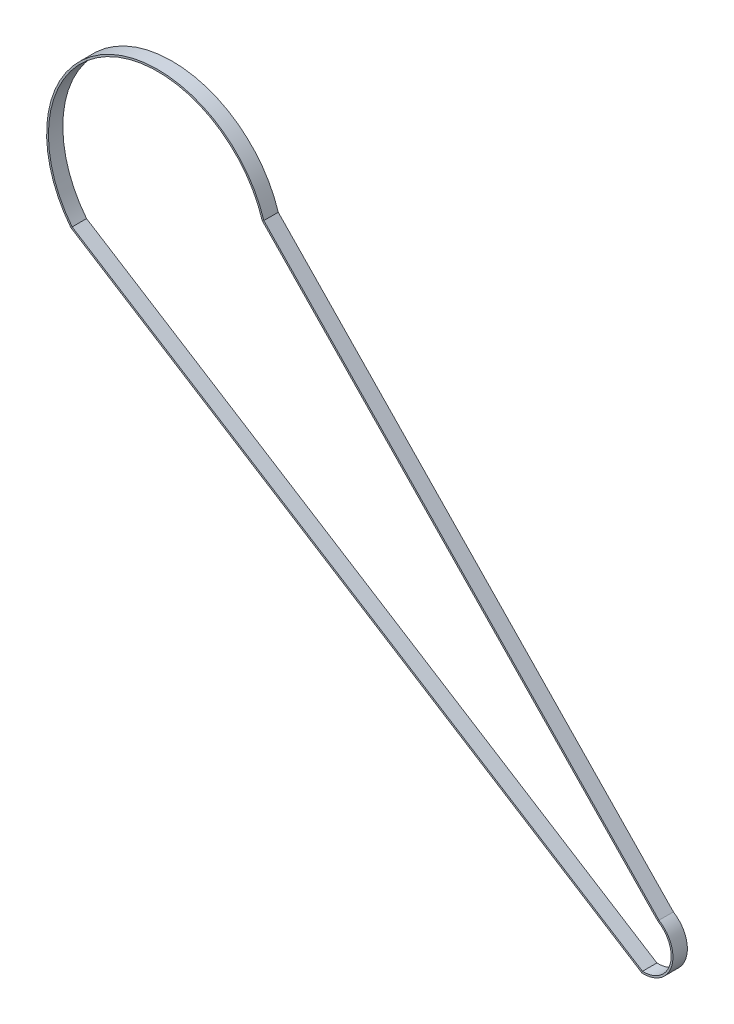
ISO-10303-21;
HEADER;
FILE_DESCRIPTION(('STEP AP214'),'2;1');
FILE_NAME('part.step','',(''),(''),'','','');
FILE_SCHEMA(('AUTOMOTIVE_DESIGN { 1 0 10303 214 1 1 1 1 }'));
ENDSEC;
DATA;
#1=APPLICATION_CONTEXT('core data for automotive mechanical design processes');
#2=APPLICATION_PROTOCOL_DEFINITION('international standard','automotive_design',2000,#1);
#3=PRODUCT_CONTEXT('',#1,'mechanical');
#4=PRODUCT('Part','Part','',(#3));
#5=PRODUCT_RELATED_PRODUCT_CATEGORY('part','',(#4));
#6=PRODUCT_DEFINITION_FORMATION('','',#4);
#7=PRODUCT_DEFINITION_CONTEXT('part definition',#1,'design');
#8=PRODUCT_DEFINITION('design','',#6,#7);
#9=PRODUCT_DEFINITION_SHAPE('','',#8);
#10=(LENGTH_UNIT() NAMED_UNIT(*) SI_UNIT(.MILLI.,.METRE.));
#11=(NAMED_UNIT(*) PLANE_ANGLE_UNIT() SI_UNIT($,.RADIAN.));
#12=(NAMED_UNIT(*) SI_UNIT($,.STERADIAN.) SOLID_ANGLE_UNIT());
#13=UNCERTAINTY_MEASURE_WITH_UNIT(LENGTH_MEASURE(1.E-05),#10,'distance_accuracy_value','');
#14=(GEOMETRIC_REPRESENTATION_CONTEXT(3) GLOBAL_UNCERTAINTY_ASSIGNED_CONTEXT((#13)) GLOBAL_UNIT_ASSIGNED_CONTEXT((#10,
#11,#12)) REPRESENTATION_CONTEXT('',''));
#15=CARTESIAN_POINT('',(0.,0.,0.));
#16=DIRECTION('',(0.,0.,1.));
#17=DIRECTION('',(1.,0.,0.));
#18=AXIS2_PLACEMENT_3D('',#15,#16,#17);
#19=CARTESIAN_POINT('',(136.426637508581,-40.646582291838,0.));
#20=DIRECTION('',(0.,0.,-1.));
#21=DIRECTION('',(-1.,0.,0.));
#22=AXIS2_PLACEMENT_3D('',#19,#20,#21);
#23=CYLINDRICAL_SURFACE('',#22,8.1833821549531);
#24=CARTESIAN_POINT('',(136.426637508581,-40.646582291838,2.01184288699567));
#25=DIRECTION('',(0.,0.,-1.));
#26=DIRECTION('',(-1.,0.,0.));
#27=AXIS2_PLACEMENT_3D('',#24,#25,#26);
#28=CIRCLE('',#27,8.1833821549531);
#29=CARTESIAN_POINT('',(140.716996476225,-33.6780413094834,2.01184288699567));
#30=VERTEX_POINT('',#29);
#31=CARTESIAN_POINT('',(135.949528288203,-48.8160443479244,2.01184288699567));
#32=VERTEX_POINT('',#31);
#33=EDGE_CURVE('E64',#30,#32,#28,.T.);
#34=ORIENTED_EDGE('',*,*,#33,.T.);
#35=CARTESIAN_POINT('',(135.949528288203,-48.8160443479244,2.01184288699567));
#36=DIRECTION('',(0.,0.,-1.));
#37=VECTOR('',#36,1.);
#38=LINE('',#35,#37);
#39=CARTESIAN_POINT('',(135.949528288203,-48.8160443479244,-2.01184288699567));
#40=VERTEX_POINT('',#39);
#41=EDGE_CURVE('E113',#32,#40,#38,.T.);
#42=ORIENTED_EDGE('',*,*,#41,.T.);
#43=CARTESIAN_POINT('',(136.426637508581,-40.646582291838,-2.01184288699567));
#44=DIRECTION('',(0.,0.,-1.));
#45=DIRECTION('',(-1.,0.,0.));
#46=AXIS2_PLACEMENT_3D('',#43,#44,#45);
#47=CIRCLE('',#46,8.18338215495311);
#48=CARTESIAN_POINT('',(140.716996476225,-33.6780413094834,-2.01184288699567));
#49=VERTEX_POINT('',#48);
#50=EDGE_CURVE('E131',#49,#40,#47,.T.);
#51=ORIENTED_EDGE('',*,*,#50,.F.);
#52=DIRECTION('',(0.,0.,1.));
#53=VECTOR('',#52,1.);
#54=CARTESIAN_POINT('',(140.716996476225,-33.6780413094834,0.));
#55=LINE('',#54,#53);
#56=EDGE_CURVE('E207',#49,#30,#55,.T.);
#57=ORIENTED_EDGE('',*,*,#56,.T.);
#58=EDGE_LOOP('',(#34,#42,#51,#57));
#59=FACE_BOUND('',#58,.T.);
#60=ADVANCED_FACE('F36',(#59),#23,.T.);
#61=CARTESIAN_POINT('',(116.866624366443,-63.4781373697456,-2.01184288699567));
#62=DIRECTION('',(0.,0.,-1.));
#63=DIRECTION('',(-1.,0.,0.));
#64=AXIS2_PLACEMENT_3D('',#61,#62,#63);
#65=PLANE('',#64);
#66=ORIENTED_EDGE('',*,*,#50,.T.);
#67=CARTESIAN_POINT('',(135.949528288203,-48.8160443479244,-2.01184288699567));
#68=DIRECTION('',(0.301700403503318,0.953402782944299,0.));
#69=VECTOR('',#68,1.);
#70=LINE('',#67,#69);
#71=CARTESIAN_POINT('',(136.105468965935,-48.3232565544801,-2.01184288699567));
#72=VERTEX_POINT('',#71);
#73=EDGE_CURVE('E48',#40,#72,#70,.T.);
#74=ORIENTED_EDGE('',*,*,#73,.T.);
#75=CARTESIAN_POINT('',(136.426637508581,-40.646582291838,-2.01184288699567));
#76=DIRECTION('',(0.,0.,-1.));
#77=DIRECTION('',(-1.,0.,0.));
#78=AXIS2_PLACEMENT_3D('',#75,#76,#77);
#79=CIRCLE('',#78,7.68338967952924);
#80=CARTESIAN_POINT('',(140.402032839187,-34.0715759091121,-2.01184288699567));
#81=VERTEX_POINT('',#80);
#82=EDGE_CURVE('E136',#81,#72,#79,.T.);
#83=ORIENTED_EDGE('',*,*,#82,.F.);
#84=DIRECTION('',(0.624859501450093,0.780737217921332,0.));
#85=VECTOR('',#84,1.);
#86=CARTESIAN_POINT('',(116.866624366443,-63.4781373697456,-2.01184288699567));
#87=LINE('',#86,#85);
#88=EDGE_CURVE('E134',#81,#49,#87,.T.);
#89=ORIENTED_EDGE('',*,*,#88,.T.);
#90=EDGE_LOOP('',(#66,#74,#83,#89));
#91=FACE_BOUND('',#90,.T.);
#92=ADVANCED_FACE('F132',(#91),#65,.T.);
#93=CARTESIAN_POINT('',(136.426637508581,-40.646582291838,0.));
#94=DIRECTION('',(0.,0.,-1.));
#95=DIRECTION('',(-1.,0.,0.));
#96=AXIS2_PLACEMENT_3D('',#93,#94,#95);
#97=CYLINDRICAL_SURFACE('',#96,7.68338967952924);
#98=ORIENTED_EDGE('',*,*,#82,.T.);
#99=CARTESIAN_POINT('',(136.105468965935,-48.3232565544801,-2.01184288699567));
#100=DIRECTION('',(0.,0.,1.));
#101=VECTOR('',#100,1.);
#102=LINE('',#99,#101);
#103=CARTESIAN_POINT('',(136.105468965935,-48.3232565544801,2.01184288699567));
#104=VERTEX_POINT('',#103);
#105=EDGE_CURVE('E12',#72,#104,#102,.T.);
#106=ORIENTED_EDGE('',*,*,#105,.T.);
#107=CARTESIAN_POINT('',(136.426637508581,-40.646582291838,2.01184288699567));
#108=DIRECTION('',(0.,0.,-1.));
#109=DIRECTION('',(-1.,0.,0.));
#110=AXIS2_PLACEMENT_3D('',#107,#108,#109);
#111=CIRCLE('',#110,7.68338967952924);
#112=CARTESIAN_POINT('',(140.402032839187,-34.0715759091121,2.01184288699567));
#113=VERTEX_POINT('',#112);
#114=EDGE_CURVE('E177',#113,#104,#111,.T.);
#115=ORIENTED_EDGE('',*,*,#114,.F.);
#116=DIRECTION('',(0.,0.,-1.));
#117=VECTOR('',#116,1.);
#118=CARTESIAN_POINT('',(140.402032839187,-34.0715759091121,0.));
#119=LINE('',#118,#117);
#120=EDGE_CURVE('E211',#113,#81,#119,.T.);
#121=ORIENTED_EDGE('',*,*,#120,.T.);
#122=EDGE_LOOP('',(#98,#106,#115,#121));
#123=FACE_BOUND('',#122,.T.);
#124=ADVANCED_FACE('F162',(#123),#97,.F.);
#125=CARTESIAN_POINT('',(116.866624366443,-63.4781373697456,2.01184288699567));
#126=DIRECTION('',(0.,0.,1.));
#127=DIRECTION('',(1.,0.,0.));
#128=AXIS2_PLACEMENT_3D('',#125,#126,#127);
#129=PLANE('',#128);
#130=ORIENTED_EDGE('',*,*,#114,.T.);
#131=CARTESIAN_POINT('',(136.105468965935,-48.3232565544801,2.01184288699567));
#132=DIRECTION('',(-0.301700403503289,-0.953402782944309,0.));
#133=VECTOR('',#132,1.);
#134=LINE('',#131,#133);
#135=EDGE_CURVE('E55',#104,#32,#134,.T.);
#136=ORIENTED_EDGE('',*,*,#135,.T.);
#137=ORIENTED_EDGE('',*,*,#33,.F.);
#138=DIRECTION('',(-0.624859501450093,-0.780737217921332,0.));
#139=VECTOR('',#138,1.);
#140=CARTESIAN_POINT('',(116.866624366443,-63.4781373697456,2.01184288699567));
#141=LINE('',#140,#139);
#142=EDGE_CURVE('E137',#30,#113,#141,.T.);
#143=ORIENTED_EDGE('',*,*,#142,.T.);
#144=EDGE_LOOP('',(#130,#136,#137,#143));
#145=FACE_BOUND('',#144,.T.);
#146=ADVANCED_FACE('F38',(#145),#129,.T.);
#147=CARTESIAN_POINT('',(30.3756081974133,80.349878016199,0.));
#148=DIRECTION('',(-0.718628001309774,-0.695394704993876,0.));
#149=DIRECTION('',(0.695394704993876,-0.718628001309774,0.));
#150=AXIS2_PLACEMENT_3D('',#147,#148,#149);
#151=PLANE('',#150);
#152=ORIENTED_EDGE('',*,*,#56,.F.);
#153=DIRECTION('',(0.695394704993876,-0.718628001309774,0.));
#154=VECTOR('',#153,1.);
#155=CARTESIAN_POINT('',(30.3756081974133,80.349878016199,-2.01184288699567));
#156=LINE('',#155,#154);
#157=CARTESIAN_POINT('',(30.3756081974133,80.349878016199,-2.01184288699567));
#158=VERTEX_POINT('',#157);
#159=EDGE_CURVE('E218',#158,#49,#156,.T.);
#160=ORIENTED_EDGE('',*,*,#159,.F.);
#161=DIRECTION('',(0.,0.,-1.));
#162=VECTOR('',#161,1.);
#163=CARTESIAN_POINT('',(30.3756081974133,80.349878016199,0.));
#164=LINE('',#163,#162);
#165=CARTESIAN_POINT('',(30.3756081974133,80.349878016199,2.01184288699567));
#166=VERTEX_POINT('',#165);
#167=EDGE_CURVE('E222',#166,#158,#164,.T.);
#168=ORIENTED_EDGE('',*,*,#167,.F.);
#169=DIRECTION('',(0.695394704993876,-0.718628001309774,0.));
#170=VECTOR('',#169,1.);
#171=CARTESIAN_POINT('',(30.3756081974133,80.349878016199,2.01184288699567));
#172=LINE('',#171,#170);
#173=EDGE_CURVE('E208',#166,#30,#172,.T.);
#174=ORIENTED_EDGE('',*,*,#173,.T.);
#175=EDGE_LOOP('',(#152,#160,#168,#174));
#176=FACE_BOUND('',#175,.T.);
#177=ADVANCED_FACE('F276',(#176),#151,.F.);
#178=CARTESIAN_POINT('',(-23.1455576442709,48.5799792922034,-2.01184288699567));
#179=DIRECTION('',(0.,0.,1.));
#180=DIRECTION('',(1.,0.,0.));
#181=AXIS2_PLACEMENT_3D('',#178,#179,#180);
#182=PLANE('',#181);
#183=ORIENTED_EDGE('',*,*,#88,.F.);
#184=DIRECTION('',(0.695394704993876,-0.718628001309774,0.));
#185=VECTOR('',#184,1.);
#186=CARTESIAN_POINT('',(29.9336789323946,80.0875509952529,-2.01184288699567));
#187=LINE('',#186,#185);
#188=CARTESIAN_POINT('',(29.9336789323946,80.0875509952529,-2.01184288699567));
#189=VERTEX_POINT('',#188);
#190=EDGE_CURVE('E215',#189,#81,#187,.T.);
#191=ORIENTED_EDGE('',*,*,#190,.F.);
#192=DIRECTION('',(-0.859913233424366,-0.510440232526446,0.));
#193=VECTOR('',#192,1.);
#194=CARTESIAN_POINT('',(-23.1455576442709,48.5799792922034,-2.01184288699567));
#195=LINE('',#194,#193);
#196=EDGE_CURVE('E225',#158,#189,#195,.T.);
#197=ORIENTED_EDGE('',*,*,#196,.F.);
#198=ORIENTED_EDGE('',*,*,#159,.T.);
#199=EDGE_LOOP('',(#183,#191,#197,#198));
#200=FACE_BOUND('',#199,.T.);
#201=ADVANCED_FACE('F262',(#200),#182,.F.);
#202=CARTESIAN_POINT('',(29.9336789323946,80.0875509952529,0.));
#203=DIRECTION('',(0.718628001309774,0.695394704993876,0.));
#204=DIRECTION('',(-0.695394704993876,0.718628001309774,0.));
#205=AXIS2_PLACEMENT_3D('',#202,#203,#204);
#206=PLANE('',#205);
#207=ORIENTED_EDGE('',*,*,#120,.F.);
#208=DIRECTION('',(0.695394704993876,-0.718628001309774,0.));
#209=VECTOR('',#208,1.);
#210=CARTESIAN_POINT('',(29.9336789323946,80.0875509952529,2.01184288699567));
#211=LINE('',#210,#209);
#212=CARTESIAN_POINT('',(29.9336789323946,80.0875509952529,2.01184288699567));
#213=VERTEX_POINT('',#212);
#214=EDGE_CURVE('E212',#213,#113,#211,.T.);
#215=ORIENTED_EDGE('',*,*,#214,.F.);
#216=DIRECTION('',(0.,0.,-1.));
#217=VECTOR('',#216,1.);
#218=CARTESIAN_POINT('',(29.9336789323946,80.0875509952529,0.));
#219=LINE('',#218,#217);
#220=EDGE_CURVE('E251',#189,#213,#219,.F.);
#221=ORIENTED_EDGE('',*,*,#220,.F.);
#222=ORIENTED_EDGE('',*,*,#190,.T.);
#223=EDGE_LOOP('',(#207,#215,#221,#222));
#224=FACE_BOUND('',#223,.T.);
#225=ADVANCED_FACE('F265',(#224),#206,.F.);
#226=CARTESIAN_POINT('',(-23.1455576442709,48.5799792922034,2.01184288699567));
#227=DIRECTION('',(0.,0.,-1.));
#228=DIRECTION('',(-1.,0.,0.));
#229=AXIS2_PLACEMENT_3D('',#226,#227,#228);
#230=PLANE('',#229);
#231=ORIENTED_EDGE('',*,*,#142,.F.);
#232=ORIENTED_EDGE('',*,*,#173,.F.);
#233=DIRECTION('',(0.859913233424366,0.510440232526446,0.));
#234=VECTOR('',#233,1.);
#235=CARTESIAN_POINT('',(-23.1455576442709,48.5799792922034,2.01184288699567));
#236=LINE('',#235,#234);
#237=EDGE_CURVE('E221',#213,#166,#236,.T.);
#238=ORIENTED_EDGE('',*,*,#237,.F.);
#239=ORIENTED_EDGE('',*,*,#214,.T.);
#240=EDGE_LOOP('',(#231,#232,#238,#239));
#241=FACE_BOUND('',#240,.T.);
#242=ADVANCED_FACE('F158',(#241),#230,.F.);
#243=CARTESIAN_POINT('',(-24.3853679092355,50.668625887519,-2.01184288699567));
#244=DIRECTION('',(0.,0.,-1.));
#245=DIRECTION('',(-1.,0.,0.));
#246=AXIS2_PLACEMENT_3D('',#243,#244,#245);
#247=PLANE('',#246);
#248=CARTESIAN_POINT('',(0.761678218719838,71.0499772331448,-2.01184288699567));
#249=DIRECTION('',(0.,0.,-1.));
#250=DIRECTION('',(-1.,0.,0.));
#251=AXIS2_PLACEMENT_3D('',#248,#249,#250);
#252=CIRCLE('',#251,31.0398615228485);
#253=CARTESIAN_POINT('',(-23.4867332710543,51.6724762699091,-2.01184288699567));
#254=VERTEX_POINT('',#253);
#255=EDGE_CURVE('E226',#254,#158,#252,.T.);
#256=ORIENTED_EDGE('',*,*,#255,.T.);
#257=ORIENTED_EDGE('',*,*,#196,.T.);
#258=CARTESIAN_POINT('',(0.761678218719838,71.0499772331448,-2.01184288699567));
#259=DIRECTION('',(0.,0.,-1.));
#260=DIRECTION('',(-1.,0.,0.));
#261=AXIS2_PLACEMENT_3D('',#258,#259,#260);
#262=CIRCLE('',#261,30.5398651788803);
#263=CARTESIAN_POINT('',(-23.1484937423733,52.0503182379119,-2.01184288699567));
#264=VERTEX_POINT('',#263);
#265=EDGE_CURVE('E235',#264,#189,#262,.T.);
#266=ORIENTED_EDGE('',*,*,#265,.F.);
#267=DIRECTION('',(-0.666981455624288,-0.745074317000194,0.));
#268=VECTOR('',#267,1.);
#269=CARTESIAN_POINT('',(-24.3853679092355,50.668625887519,-2.01184288699567));
#270=LINE('',#269,#268);
#271=EDGE_CURVE('E239',#264,#254,#270,.T.);
#272=ORIENTED_EDGE('',*,*,#271,.T.);
#273=EDGE_LOOP('',(#256,#257,#266,#272));
#274=FACE_BOUND('',#273,.T.);
#275=ADVANCED_FACE('F271',(#274),#247,.T.);
#276=CARTESIAN_POINT('',(0.761678218719838,71.0499772331448,0.));
#277=DIRECTION('',(0.,0.,-1.));
#278=DIRECTION('',(-1.,0.,0.));
#279=AXIS2_PLACEMENT_3D('',#276,#277,#278);
#280=CYLINDRICAL_SURFACE('',#279,30.5398651788803);
#281=ORIENTED_EDGE('',*,*,#265,.T.);
#282=ORIENTED_EDGE('',*,*,#220,.T.);
#283=CARTESIAN_POINT('',(0.761678218719838,71.0499772331448,2.01184288699567));
#284=DIRECTION('',(0.,0.,-1.));
#285=DIRECTION('',(-1.,0.,0.));
#286=AXIS2_PLACEMENT_3D('',#283,#284,#285);
#287=CIRCLE('',#286,30.5398651788803);
#288=CARTESIAN_POINT('',(-23.1484937423733,52.0503182379119,2.01184288699567));
#289=VERTEX_POINT('',#288);
#290=EDGE_CURVE('E232',#289,#213,#287,.T.);
#291=ORIENTED_EDGE('',*,*,#290,.F.);
#292=DIRECTION('',(0.,0.,-1.));
#293=VECTOR('',#292,1.);
#294=CARTESIAN_POINT('',(-23.1484937423733,52.0503182379119,-2.01184288699567));
#295=LINE('',#294,#293);
#296=EDGE_CURVE('E242',#289,#264,#295,.T.);
#297=ORIENTED_EDGE('',*,*,#296,.T.);
#298=EDGE_LOOP('',(#281,#282,#291,#297));
#299=FACE_BOUND('',#298,.T.);
#300=ADVANCED_FACE('F268',(#299),#280,.F.);
#301=CARTESIAN_POINT('',(-24.3853679092355,50.668625887519,2.01184288699567));
#302=DIRECTION('',(0.,0.,1.));
#303=DIRECTION('',(1.,0.,0.));
#304=AXIS2_PLACEMENT_3D('',#301,#302,#303);
#305=PLANE('',#304);
#306=ORIENTED_EDGE('',*,*,#290,.T.);
#307=ORIENTED_EDGE('',*,*,#237,.T.);
#308=CARTESIAN_POINT('',(0.761678218719838,71.0499772331448,2.01184288699567));
#309=DIRECTION('',(0.,0.,-1.));
#310=DIRECTION('',(-1.,0.,0.));
#311=AXIS2_PLACEMENT_3D('',#308,#309,#310);
#312=CIRCLE('',#311,31.0398615228485);
#313=CARTESIAN_POINT('',(-23.4867332710543,51.6724762699091,2.01184288699567));
#314=VERTEX_POINT('',#313);
#315=EDGE_CURVE('E229',#314,#166,#312,.T.);
#316=ORIENTED_EDGE('',*,*,#315,.F.);
#317=DIRECTION('',(0.666981455624288,0.745074317000194,0.));
#318=VECTOR('',#317,1.);
#319=CARTESIAN_POINT('',(-24.3853679092355,50.668625887519,2.01184288699567));
#320=LINE('',#319,#318);
#321=EDGE_CURVE('E245',#314,#289,#320,.T.);
#322=ORIENTED_EDGE('',*,*,#321,.T.);
#323=EDGE_LOOP('',(#306,#307,#316,#322));
#324=FACE_BOUND('',#323,.T.);
#325=ADVANCED_FACE('F279',(#324),#305,.T.);
#326=CARTESIAN_POINT('',(0.761678218719838,71.0499772331448,0.));
#327=DIRECTION('',(0.,0.,-1.));
#328=DIRECTION('',(-1.,0.,0.));
#329=AXIS2_PLACEMENT_3D('',#326,#327,#328);
#330=CYLINDRICAL_SURFACE('',#329,31.0398615228485);
#331=ORIENTED_EDGE('',*,*,#315,.T.);
#332=ORIENTED_EDGE('',*,*,#167,.T.);
#333=ORIENTED_EDGE('',*,*,#255,.F.);
#334=DIRECTION('',(0.,0.,1.));
#335=VECTOR('',#334,1.);
#336=CARTESIAN_POINT('',(-23.4867332710543,51.6724762699091,-2.01184288699567));
#337=LINE('',#336,#335);
#338=EDGE_CURVE('E115',#254,#314,#337,.T.);
#339=ORIENTED_EDGE('',*,*,#338,.T.);
#340=EDGE_LOOP('',(#331,#332,#333,#339));
#341=FACE_BOUND('',#340,.T.);
#342=ADVANCED_FACE('F274',(#341),#330,.T.);
#343=CARTESIAN_POINT('',(-30.3127553783959,55.9747509706478,-2.01184288699567));
#344=DIRECTION('',(0.,0.,1.));
#345=DIRECTION('',(1.,0.,0.));
#346=AXIS2_PLACEMENT_3D('',#343,#344,#345);
#347=PLANE('',#346);
#348=ORIENTED_EDGE('',*,*,#271,.F.);
#349=DIRECTION('',(0.84598637626733,-0.533204511580755,0.));
#350=VECTOR('',#349,1.);
#351=CARTESIAN_POINT('',(-30.0461531226056,56.3977441587815,-2.01184288699567));
#352=LINE('',#351,#350);
#353=EDGE_CURVE('E118',#264,#72,#352,.T.);
#354=ORIENTED_EDGE('',*,*,#353,.T.);
#355=ORIENTED_EDGE('',*,*,#73,.F.);
#356=DIRECTION('',(0.84598637626733,-0.533204511580755,0.));
#357=VECTOR('',#356,1.);
#358=CARTESIAN_POINT('',(-30.3127553783959,55.9747509706478,-2.01184288699567));
#359=LINE('',#358,#357);
#360=EDGE_CURVE('E109',#254,#40,#359,.T.);
#361=ORIENTED_EDGE('',*,*,#360,.F.);
#362=EDGE_LOOP('',(#348,#354,#355,#361));
#363=FACE_BOUND('',#362,.T.);
#364=ADVANCED_FACE('F123',(#363),#347,.F.);
#365=CARTESIAN_POINT('',(-30.0461531226056,56.3977441587815,-2.01184288699567));
#366=DIRECTION('',(-0.533204511580755,-0.84598637626733,0.));
#367=DIRECTION('',(0.84598637626733,-0.533204511580755,0.));
#368=AXIS2_PLACEMENT_3D('',#365,#366,#367);
#369=PLANE('',#368);
#370=ORIENTED_EDGE('',*,*,#296,.F.);
#371=DIRECTION('',(0.84598637626733,-0.533204511580755,0.));
#372=VECTOR('',#371,1.);
#373=CARTESIAN_POINT('',(-30.0461531226056,56.3977441587815,2.01184288699567));
#374=LINE('',#373,#372);
#375=EDGE_CURVE('E147',#289,#104,#374,.T.);
#376=ORIENTED_EDGE('',*,*,#375,.T.);
#377=ORIENTED_EDGE('',*,*,#105,.F.);
#378=ORIENTED_EDGE('',*,*,#353,.F.);
#379=EDGE_LOOP('',(#370,#376,#377,#378));
#380=FACE_BOUND('',#379,.T.);
#381=ADVANCED_FACE('F367',(#380),#369,.F.);
#382=CARTESIAN_POINT('',(-30.3127553783959,55.9747509706478,2.01184288699567));
#383=DIRECTION('',(0.,0.,-1.));
#384=DIRECTION('',(-1.,0.,0.));
#385=AXIS2_PLACEMENT_3D('',#382,#383,#384);
#386=PLANE('',#385);
#387=ORIENTED_EDGE('',*,*,#321,.F.);
#388=DIRECTION('',(0.84598637626733,-0.533204511580755,0.));
#389=VECTOR('',#388,1.);
#390=CARTESIAN_POINT('',(-30.3127553783959,55.9747509706478,2.01184288699567));
#391=LINE('',#390,#389);
#392=EDGE_CURVE('E248',#314,#32,#391,.T.);
#393=ORIENTED_EDGE('',*,*,#392,.T.);
#394=ORIENTED_EDGE('',*,*,#135,.F.);
#395=ORIENTED_EDGE('',*,*,#375,.F.);
#396=EDGE_LOOP('',(#387,#393,#394,#395));
#397=FACE_BOUND('',#396,.T.);
#398=ADVANCED_FACE('F375',(#397),#386,.F.);
#399=CARTESIAN_POINT('',(-30.3127553783959,55.9747509706478,-2.01184288699567));
#400=DIRECTION('',(0.533204511580755,0.84598637626733,0.));
#401=DIRECTION('',(-0.84598637626733,0.533204511580755,0.));
#402=AXIS2_PLACEMENT_3D('',#399,#400,#401);
#403=PLANE('',#402);
#404=ORIENTED_EDGE('',*,*,#338,.F.);
#405=ORIENTED_EDGE('',*,*,#360,.T.);
#406=ORIENTED_EDGE('',*,*,#41,.F.);
#407=ORIENTED_EDGE('',*,*,#392,.F.);
#408=EDGE_LOOP('',(#404,#405,#406,#407));
#409=FACE_BOUND('',#408,.T.);
#410=ADVANCED_FACE('F111',(#409),#403,.F.);
#411=CLOSED_SHELL('',(#60,#92,#124,#146,#177,#201,#225,#242,#275,#300,#325,#342,#364,#381,#398,#410));
#412=MANIFOLD_SOLID_BREP('B2',#411);
#413=ADVANCED_BREP_SHAPE_REPRESENTATION('',(#18,#412),#14);
#414=SHAPE_DEFINITION_REPRESENTATION(#9,#413);
ENDSEC;
END-ISO-10303-21;
